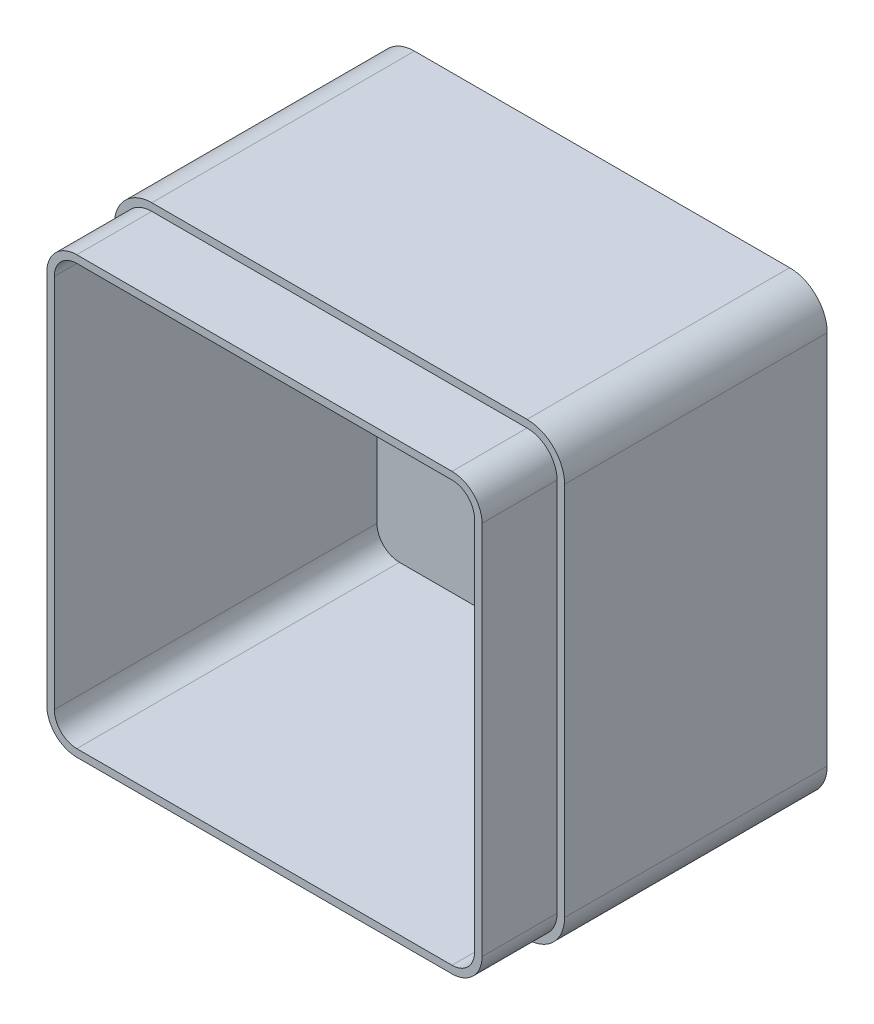
ISO-10303-21;
HEADER;
FILE_DESCRIPTION(('STEP AP214'),'2;1');
FILE_NAME('part.step','',(''),(''),'','','');
FILE_SCHEMA(('AUTOMOTIVE_DESIGN { 1 0 10303 214 1 1 1 1 }'));
ENDSEC;
DATA;
#1=APPLICATION_CONTEXT('core data for automotive mechanical design processes');
#2=APPLICATION_PROTOCOL_DEFINITION('international standard','automotive_design',2000,#1);
#3=PRODUCT_CONTEXT('',#1,'mechanical');
#4=PRODUCT('Part','Part','',(#3));
#5=PRODUCT_RELATED_PRODUCT_CATEGORY('part','',(#4));
#6=PRODUCT_DEFINITION_FORMATION('','',#4);
#7=PRODUCT_DEFINITION_CONTEXT('part definition',#1,'design');
#8=PRODUCT_DEFINITION('design','',#6,#7);
#9=PRODUCT_DEFINITION_SHAPE('','',#8);
#10=(LENGTH_UNIT() NAMED_UNIT(*) SI_UNIT(.MILLI.,.METRE.));
#11=(NAMED_UNIT(*) PLANE_ANGLE_UNIT() SI_UNIT($,.RADIAN.));
#12=(NAMED_UNIT(*) SI_UNIT($,.STERADIAN.) SOLID_ANGLE_UNIT());
#13=UNCERTAINTY_MEASURE_WITH_UNIT(LENGTH_MEASURE(1.E-05),#10,'distance_accuracy_value','');
#14=(GEOMETRIC_REPRESENTATION_CONTEXT(3) GLOBAL_UNCERTAINTY_ASSIGNED_CONTEXT((#13)) GLOBAL_UNIT_ASSIGNED_CONTEXT((#10,
#11,#12)) REPRESENTATION_CONTEXT('',''));
#15=CARTESIAN_POINT('',(0.,0.,0.));
#16=DIRECTION('',(0.,0.,1.));
#17=DIRECTION('',(1.,0.,0.));
#18=AXIS2_PLACEMENT_3D('',#15,#16,#17);
#19=CARTESIAN_POINT('',(0.,0.,90.));
#20=DIRECTION('',(0.,0.,-1.));
#21=DIRECTION('',(-1.,0.,0.));
#22=AXIS2_PLACEMENT_3D('',#19,#20,#21);
#23=PLANE('',#22);
#24=DIRECTION('',(0.,-1.,0.));
#25=VECTOR('',#24,1.);
#26=CARTESIAN_POINT('',(4.,0.,90.));
#27=LINE('',#26,#25);
#28=CARTESIAN_POINT('',(3.99999999999996,110.,90.));
#29=VERTEX_POINT('',#28);
#30=CARTESIAN_POINT('',(4.,10.,90.));
#31=VERTEX_POINT('',#30);
#32=EDGE_CURVE('E349',#29,#31,#27,.T.);
#33=ORIENTED_EDGE('',*,*,#32,.F.);
#34=CARTESIAN_POINT('',(9.99999999999996,110.,90.));
#35=DIRECTION('',(0.,0.,-1.));
#36=DIRECTION('',(-1.,0.,0.));
#37=AXIS2_PLACEMENT_3D('',#34,#35,#36);
#38=CIRCLE('',#37,6.);
#39=CARTESIAN_POINT('',(9.99999999999996,116.,90.));
#40=VERTEX_POINT('',#39);
#41=EDGE_CURVE('E327',#40,#29,#38,.F.);
#42=ORIENTED_EDGE('',*,*,#41,.F.);
#43=DIRECTION('',(-1.,0.,0.));
#44=VECTOR('',#43,1.);
#45=CARTESIAN_POINT('',(0.,116.,90.));
#46=LINE('',#45,#44);
#47=CARTESIAN_POINT('',(110.,116.,90.));
#48=VERTEX_POINT('',#47);
#49=EDGE_CURVE('E363',#48,#40,#46,.T.);
#50=ORIENTED_EDGE('',*,*,#49,.F.);
#51=CARTESIAN_POINT('',(110.,110.,90.));
#52=DIRECTION('',(0.,0.,-1.));
#53=DIRECTION('',(-1.,0.,0.));
#54=AXIS2_PLACEMENT_3D('',#51,#52,#53);
#55=CIRCLE('',#54,6.);
#56=CARTESIAN_POINT('',(116.,110.,90.));
#57=VERTEX_POINT('',#56);
#58=EDGE_CURVE('E394',#57,#48,#55,.F.);
#59=ORIENTED_EDGE('',*,*,#58,.F.);
#60=DIRECTION('',(0.,1.,0.));
#61=VECTOR('',#60,1.);
#62=CARTESIAN_POINT('',(116.,0.,90.));
#63=LINE('',#62,#61);
#64=CARTESIAN_POINT('',(116.,10.,90.));
#65=VERTEX_POINT('',#64);
#66=EDGE_CURVE('E391',#65,#57,#63,.T.);
#67=ORIENTED_EDGE('',*,*,#66,.F.);
#68=CARTESIAN_POINT('',(110.,10.,90.));
#69=DIRECTION('',(0.,0.,-1.));
#70=DIRECTION('',(-1.,0.,0.));
#71=AXIS2_PLACEMENT_3D('',#68,#69,#70);
#72=CIRCLE('',#71,6.);
#73=CARTESIAN_POINT('',(110.,4.,90.));
#74=VERTEX_POINT('',#73);
#75=EDGE_CURVE('E387',#74,#65,#72,.F.);
#76=ORIENTED_EDGE('',*,*,#75,.F.);
#77=DIRECTION('',(1.,0.,0.));
#78=VECTOR('',#77,1.);
#79=CARTESIAN_POINT('',(0.,4.,90.));
#80=LINE('',#79,#78);
#81=CARTESIAN_POINT('',(9.99999999999999,4.,90.));
#82=VERTEX_POINT('',#81);
#83=EDGE_CURVE('E384',#82,#74,#80,.T.);
#84=ORIENTED_EDGE('',*,*,#83,.F.);
#85=CARTESIAN_POINT('',(9.99999999999999,10.,90.));
#86=DIRECTION('',(0.,0.,-1.));
#87=DIRECTION('',(-1.,0.,0.));
#88=AXIS2_PLACEMENT_3D('',#85,#86,#87);
#89=CIRCLE('',#88,6.);
#90=EDGE_CURVE('E372',#31,#82,#89,.F.);
#91=ORIENTED_EDGE('',*,*,#90,.F.);
#92=EDGE_LOOP('',(#33,#42,#50,#59,#67,#76,#84,#91));
#93=FACE_BOUND('',#92,.T.);
#94=CARTESIAN_POINT('',(9.99999999999996,110.,90.));
#95=DIRECTION('',(0.,0.,1.));
#96=DIRECTION('',(1.,0.,0.));
#97=AXIS2_PLACEMENT_3D('',#94,#95,#96);
#98=CIRCLE('',#97,8.);
#99=CARTESIAN_POINT('',(9.99999999999995,118.,90.));
#100=VERTEX_POINT('',#99);
#101=CARTESIAN_POINT('',(1.99999999999996,110.,90.));
#102=VERTEX_POINT('',#101);
#103=EDGE_CURVE('E255',#100,#102,#98,.T.);
#104=ORIENTED_EDGE('',*,*,#103,.T.);
#105=DIRECTION('',(0.,-1.,0.));
#106=VECTOR('',#105,1.);
#107=CARTESIAN_POINT('',(1.99999999999996,110.,90.));
#108=LINE('',#107,#106);
#109=CARTESIAN_POINT('',(2.,9.99999999999999,90.));
#110=VERTEX_POINT('',#109);
#111=EDGE_CURVE('E205',#102,#110,#108,.T.);
#112=ORIENTED_EDGE('',*,*,#111,.T.);
#113=CARTESIAN_POINT('',(9.99999999999999,10.,90.));
#114=DIRECTION('',(0.,0.,1.));
#115=DIRECTION('',(1.,0.,0.));
#116=AXIS2_PLACEMENT_3D('',#113,#114,#115);
#117=CIRCLE('',#116,8.);
#118=CARTESIAN_POINT('',(9.99999999999999,2.,90.));
#119=VERTEX_POINT('',#118);
#120=EDGE_CURVE('E54',#110,#119,#117,.T.);
#121=ORIENTED_EDGE('',*,*,#120,.T.);
#122=DIRECTION('',(1.,0.,0.));
#123=VECTOR('',#122,1.);
#124=CARTESIAN_POINT('',(9.99999999999999,2.,90.));
#125=LINE('',#124,#123);
#126=CARTESIAN_POINT('',(110.,2.,90.));
#127=VERTEX_POINT('',#126);
#128=EDGE_CURVE('E262',#119,#127,#125,.T.);
#129=ORIENTED_EDGE('',*,*,#128,.T.);
#130=CARTESIAN_POINT('',(110.,10.,90.));
#131=DIRECTION('',(0.,0.,1.));
#132=DIRECTION('',(1.,0.,0.));
#133=AXIS2_PLACEMENT_3D('',#130,#131,#132);
#134=CIRCLE('',#133,7.99999999999999);
#135=CARTESIAN_POINT('',(118.,10.,90.));
#136=VERTEX_POINT('',#135);
#137=EDGE_CURVE('E266',#127,#136,#134,.T.);
#138=ORIENTED_EDGE('',*,*,#137,.T.);
#139=DIRECTION('',(0.,1.,0.));
#140=VECTOR('',#139,1.);
#141=CARTESIAN_POINT('',(118.,10.,90.));
#142=LINE('',#141,#140);
#143=CARTESIAN_POINT('',(118.,110.,90.));
#144=VERTEX_POINT('',#143);
#145=EDGE_CURVE('E270',#136,#144,#142,.T.);
#146=ORIENTED_EDGE('',*,*,#145,.T.);
#147=CARTESIAN_POINT('',(110.,110.,90.));
#148=DIRECTION('',(0.,0.,1.));
#149=DIRECTION('',(1.,0.,0.));
#150=AXIS2_PLACEMENT_3D('',#147,#148,#149);
#151=CIRCLE('',#150,7.99999999999999);
#152=CARTESIAN_POINT('',(110.,118.,90.));
#153=VERTEX_POINT('',#152);
#154=EDGE_CURVE('E232',#144,#153,#151,.T.);
#155=ORIENTED_EDGE('',*,*,#154,.T.);
#156=DIRECTION('',(-1.,0.,0.));
#157=VECTOR('',#156,1.);
#158=CARTESIAN_POINT('',(110.,118.,90.));
#159=LINE('',#158,#157);
#160=EDGE_CURVE('E228',#153,#100,#159,.T.);
#161=ORIENTED_EDGE('',*,*,#160,.T.);
#162=EDGE_LOOP('',(#104,#112,#121,#129,#138,#146,#155,#161));
#163=FACE_BOUND('',#162,.T.);
#164=ADVANCED_FACE('F38',(#93,#163),#23,.F.);
#165=CARTESIAN_POINT('',(4.,0.,90.));
#166=DIRECTION('',(1.,0.,0.));
#167=DIRECTION('',(0.,1.,0.));
#168=AXIS2_PLACEMENT_3D('',#165,#166,#167);
#169=PLANE('',#168);
#170=DIRECTION('',(0.,-1.,0.));
#171=VECTOR('',#170,1.);
#172=CARTESIAN_POINT('',(4.,0.,4.));
#173=LINE('',#172,#171);
#174=CARTESIAN_POINT('',(3.99999999999996,110.,4.));
#175=VERTEX_POINT('',#174);
#176=CARTESIAN_POINT('',(4.,10.,4.));
#177=VERTEX_POINT('',#176);
#178=EDGE_CURVE('E319',#175,#177,#173,.T.);
#179=ORIENTED_EDGE('',*,*,#178,.F.);
#180=DIRECTION('',(0.,0.,1.));
#181=VECTOR('',#180,1.);
#182=CARTESIAN_POINT('',(3.99999999999996,110.,90.));
#183=LINE('',#182,#181);
#184=EDGE_CURVE('E328',#29,#175,#183,.F.);
#185=ORIENTED_EDGE('',*,*,#184,.F.);
#186=ORIENTED_EDGE('',*,*,#32,.T.);
#187=DIRECTION('',(0.,0.,1.));
#188=VECTOR('',#187,1.);
#189=CARTESIAN_POINT('',(4.,10.,90.));
#190=LINE('',#189,#188);
#191=EDGE_CURVE('E324',#177,#31,#190,.T.);
#192=ORIENTED_EDGE('',*,*,#191,.F.);
#193=EDGE_LOOP('',(#179,#185,#186,#192));
#194=FACE_BOUND('',#193,.T.);
#195=ADVANCED_FACE('F504',(#194),#169,.T.);
#196=CARTESIAN_POINT('',(0.,4.,90.));
#197=DIRECTION('',(0.,1.,0.));
#198=DIRECTION('',(0.,0.,1.));
#199=AXIS2_PLACEMENT_3D('',#196,#197,#198);
#200=PLANE('',#199);
#201=ORIENTED_EDGE('',*,*,#83,.T.);
#202=DIRECTION('',(0.,0.,1.));
#203=VECTOR('',#202,1.);
#204=CARTESIAN_POINT('',(110.,4.,90.));
#205=LINE('',#204,#203);
#206=CARTESIAN_POINT('',(110.,4.,4.));
#207=VERTEX_POINT('',#206);
#208=EDGE_CURVE('E360',#207,#74,#205,.T.);
#209=ORIENTED_EDGE('',*,*,#208,.F.);
#210=DIRECTION('',(1.,0.,0.));
#211=VECTOR('',#210,1.);
#212=CARTESIAN_POINT('',(0.,4.,4.));
#213=LINE('',#212,#211);
#214=CARTESIAN_POINT('',(9.99999999999999,4.,4.));
#215=VERTEX_POINT('',#214);
#216=EDGE_CURVE('E323',#215,#207,#213,.T.);
#217=ORIENTED_EDGE('',*,*,#216,.F.);
#218=DIRECTION('',(0.,0.,1.));
#219=VECTOR('',#218,1.);
#220=CARTESIAN_POINT('',(9.99999999999999,4.,90.));
#221=LINE('',#220,#219);
#222=EDGE_CURVE('E344',#82,#215,#221,.F.);
#223=ORIENTED_EDGE('',*,*,#222,.F.);
#224=EDGE_LOOP('',(#201,#209,#217,#223));
#225=FACE_BOUND('',#224,.T.);
#226=ADVANCED_FACE('F510',(#225),#200,.T.);
#227=CARTESIAN_POINT('',(116.,0.,90.));
#228=DIRECTION('',(-1.,0.,0.));
#229=DIRECTION('',(0.,-1.,0.));
#230=AXIS2_PLACEMENT_3D('',#227,#228,#229);
#231=PLANE('',#230);
#232=ORIENTED_EDGE('',*,*,#66,.T.);
#233=DIRECTION('',(0.,0.,1.));
#234=VECTOR('',#233,1.);
#235=CARTESIAN_POINT('',(116.,110.,90.));
#236=LINE('',#235,#234);
#237=CARTESIAN_POINT('',(116.,110.,4.));
#238=VERTEX_POINT('',#237);
#239=EDGE_CURVE('E369',#238,#57,#236,.T.);
#240=ORIENTED_EDGE('',*,*,#239,.F.);
#241=DIRECTION('',(0.,1.,0.));
#242=VECTOR('',#241,1.);
#243=CARTESIAN_POINT('',(116.,0.,4.));
#244=LINE('',#243,#242);
#245=CARTESIAN_POINT('',(116.,10.,4.));
#246=VERTEX_POINT('',#245);
#247=EDGE_CURVE('E336',#246,#238,#244,.T.);
#248=ORIENTED_EDGE('',*,*,#247,.F.);
#249=DIRECTION('',(0.,0.,1.));
#250=VECTOR('',#249,1.);
#251=CARTESIAN_POINT('',(116.,10.,90.));
#252=LINE('',#251,#250);
#253=EDGE_CURVE('E364',#65,#246,#252,.F.);
#254=ORIENTED_EDGE('',*,*,#253,.F.);
#255=EDGE_LOOP('',(#232,#240,#248,#254));
#256=FACE_BOUND('',#255,.T.);
#257=ADVANCED_FACE('F539',(#256),#231,.T.);
#258=CARTESIAN_POINT('',(0.,116.,90.));
#259=DIRECTION('',(0.,-1.,0.));
#260=DIRECTION('',(0.,0.,-1.));
#261=AXIS2_PLACEMENT_3D('',#258,#259,#260);
#262=PLANE('',#261);
#263=ORIENTED_EDGE('',*,*,#49,.T.);
#264=DIRECTION('',(0.,0.,-1.));
#265=VECTOR('',#264,1.);
#266=CARTESIAN_POINT('',(9.99999999999996,116.,90.));
#267=LINE('',#266,#265);
#268=CARTESIAN_POINT('',(9.99999999999996,116.,4.));
#269=VERTEX_POINT('',#268);
#270=EDGE_CURVE('E368',#269,#40,#267,.F.);
#271=ORIENTED_EDGE('',*,*,#270,.F.);
#272=DIRECTION('',(-1.,0.,0.));
#273=VECTOR('',#272,1.);
#274=CARTESIAN_POINT('',(0.,116.,4.));
#275=LINE('',#274,#273);
#276=CARTESIAN_POINT('',(110.,116.,4.));
#277=VERTEX_POINT('',#276);
#278=EDGE_CURVE('E345',#277,#269,#275,.T.);
#279=ORIENTED_EDGE('',*,*,#278,.F.);
#280=DIRECTION('',(0.,0.,-1.));
#281=VECTOR('',#280,1.);
#282=CARTESIAN_POINT('',(110.,116.,90.));
#283=LINE('',#282,#281);
#284=EDGE_CURVE('E373',#48,#277,#283,.T.);
#285=ORIENTED_EDGE('',*,*,#284,.F.);
#286=EDGE_LOOP('',(#263,#271,#279,#285));
#287=FACE_BOUND('',#286,.T.);
#288=ADVANCED_FACE('F535',(#287),#262,.T.);
#289=CARTESIAN_POINT('',(0.,0.,4.));
#290=DIRECTION('',(0.,0.,-1.));
#291=DIRECTION('',(-1.,0.,0.));
#292=AXIS2_PLACEMENT_3D('',#289,#290,#291);
#293=PLANE('',#292);
#294=ORIENTED_EDGE('',*,*,#216,.T.);
#295=CARTESIAN_POINT('',(110.,10.,4.));
#296=DIRECTION('',(0.,0.,-1.));
#297=DIRECTION('',(-1.,0.,0.));
#298=AXIS2_PLACEMENT_3D('',#295,#296,#297);
#299=CIRCLE('',#298,6.);
#300=EDGE_CURVE('E339',#246,#207,#299,.T.);
#301=ORIENTED_EDGE('',*,*,#300,.F.);
#302=ORIENTED_EDGE('',*,*,#247,.T.);
#303=CARTESIAN_POINT('',(110.,110.,4.));
#304=DIRECTION('',(0.,0.,-1.));
#305=DIRECTION('',(-1.,0.,0.));
#306=AXIS2_PLACEMENT_3D('',#303,#304,#305);
#307=CIRCLE('',#306,6.);
#308=EDGE_CURVE('E343',#277,#238,#307,.T.);
#309=ORIENTED_EDGE('',*,*,#308,.F.);
#310=ORIENTED_EDGE('',*,*,#278,.T.);
#311=CARTESIAN_POINT('',(9.99999999999996,110.,4.));
#312=DIRECTION('',(0.,0.,-1.));
#313=DIRECTION('',(-1.,0.,0.));
#314=AXIS2_PLACEMENT_3D('',#311,#312,#313);
#315=CIRCLE('',#314,6.);
#316=EDGE_CURVE('E340',#175,#269,#315,.T.);
#317=ORIENTED_EDGE('',*,*,#316,.F.);
#318=ORIENTED_EDGE('',*,*,#178,.T.);
#319=CARTESIAN_POINT('',(9.99999999999999,10.,4.));
#320=DIRECTION('',(0.,0.,-1.));
#321=DIRECTION('',(-1.,0.,0.));
#322=AXIS2_PLACEMENT_3D('',#319,#320,#321);
#323=CIRCLE('',#322,6.);
#324=EDGE_CURVE('E332',#215,#177,#323,.T.);
#325=ORIENTED_EDGE('',*,*,#324,.F.);
#326=EDGE_LOOP('',(#294,#301,#302,#309,#310,#317,#318,#325));
#327=FACE_BOUND('',#326,.T.);
#328=ADVANCED_FACE('F531',(#327),#293,.F.);
#329=CARTESIAN_POINT('',(9.99999999999999,10.,90.));
#330=DIRECTION('',(0.,0.,-1.));
#331=DIRECTION('',(-1.,0.,0.));
#332=AXIS2_PLACEMENT_3D('',#329,#330,#331);
#333=CYLINDRICAL_SURFACE('',#332,6.);
#334=ORIENTED_EDGE('',*,*,#90,.T.);
#335=ORIENTED_EDGE('',*,*,#222,.T.);
#336=ORIENTED_EDGE('',*,*,#324,.T.);
#337=ORIENTED_EDGE('',*,*,#191,.T.);
#338=EDGE_LOOP('',(#334,#335,#336,#337));
#339=FACE_BOUND('',#338,.T.);
#340=ADVANCED_FACE('F527',(#339),#333,.F.);
#341=CARTESIAN_POINT('',(110.,10.,90.));
#342=DIRECTION('',(0.,0.,-1.));
#343=DIRECTION('',(-1.,0.,0.));
#344=AXIS2_PLACEMENT_3D('',#341,#342,#343);
#345=CYLINDRICAL_SURFACE('',#344,6.);
#346=ORIENTED_EDGE('',*,*,#75,.T.);
#347=ORIENTED_EDGE('',*,*,#253,.T.);
#348=ORIENTED_EDGE('',*,*,#300,.T.);
#349=ORIENTED_EDGE('',*,*,#208,.T.);
#350=EDGE_LOOP('',(#346,#347,#348,#349));
#351=FACE_BOUND('',#350,.T.);
#352=ADVANCED_FACE('F523',(#351),#345,.F.);
#353=CARTESIAN_POINT('',(110.,110.,90.));
#354=DIRECTION('',(0.,0.,-1.));
#355=DIRECTION('',(-1.,0.,0.));
#356=AXIS2_PLACEMENT_3D('',#353,#354,#355);
#357=CYLINDRICAL_SURFACE('',#356,6.);
#358=ORIENTED_EDGE('',*,*,#58,.T.);
#359=ORIENTED_EDGE('',*,*,#284,.T.);
#360=ORIENTED_EDGE('',*,*,#308,.T.);
#361=ORIENTED_EDGE('',*,*,#239,.T.);
#362=EDGE_LOOP('',(#358,#359,#360,#361));
#363=FACE_BOUND('',#362,.T.);
#364=ADVANCED_FACE('F519',(#363),#357,.F.);
#365=CARTESIAN_POINT('',(9.99999999999996,110.,90.));
#366=DIRECTION('',(0.,0.,-1.));
#367=DIRECTION('',(-1.,0.,0.));
#368=AXIS2_PLACEMENT_3D('',#365,#366,#367);
#369=CYLINDRICAL_SURFACE('',#368,6.);
#370=ORIENTED_EDGE('',*,*,#41,.T.);
#371=ORIENTED_EDGE('',*,*,#184,.T.);
#372=ORIENTED_EDGE('',*,*,#316,.T.);
#373=ORIENTED_EDGE('',*,*,#270,.T.);
#374=EDGE_LOOP('',(#370,#371,#372,#373));
#375=FACE_BOUND('',#374,.T.);
#376=ADVANCED_FACE('F516',(#375),#369,.F.);
#377=CARTESIAN_POINT('',(9.99999999999996,110.,70.));
#378=DIRECTION('',(0.,0.,1.));
#379=DIRECTION('',(1.,0.,0.));
#380=AXIS2_PLACEMENT_3D('',#377,#378,#379);
#381=PLANE('',#380);
#382=DIRECTION('',(-1.,0.,0.));
#383=VECTOR('',#382,1.);
#384=CARTESIAN_POINT('',(110.,118.,70.));
#385=LINE('',#384,#383);
#386=CARTESIAN_POINT('',(110.,118.,70.));
#387=VERTEX_POINT('',#386);
#388=CARTESIAN_POINT('',(9.99999999999995,118.,70.));
#389=VERTEX_POINT('',#388);
#390=EDGE_CURVE('E212',#387,#389,#385,.T.);
#391=ORIENTED_EDGE('',*,*,#390,.F.);
#392=CARTESIAN_POINT('',(110.,110.,70.));
#393=DIRECTION('',(0.,0.,1.));
#394=DIRECTION('',(1.,0.,0.));
#395=AXIS2_PLACEMENT_3D('',#392,#393,#394);
#396=CIRCLE('',#395,7.99999999999999);
#397=CARTESIAN_POINT('',(118.,110.,70.));
#398=VERTEX_POINT('',#397);
#399=EDGE_CURVE('E249',#398,#387,#396,.T.);
#400=ORIENTED_EDGE('',*,*,#399,.F.);
#401=DIRECTION('',(0.,1.,0.));
#402=VECTOR('',#401,1.);
#403=CARTESIAN_POINT('',(118.,10.,70.));
#404=LINE('',#403,#402);
#405=CARTESIAN_POINT('',(118.,10.,70.));
#406=VERTEX_POINT('',#405);
#407=EDGE_CURVE('E245',#406,#398,#404,.T.);
#408=ORIENTED_EDGE('',*,*,#407,.F.);
#409=CARTESIAN_POINT('',(110.,10.,70.));
#410=DIRECTION('',(0.,0.,1.));
#411=DIRECTION('',(1.,0.,0.));
#412=AXIS2_PLACEMENT_3D('',#409,#410,#411);
#413=CIRCLE('',#412,7.99999999999999);
#414=CARTESIAN_POINT('',(110.,2.,70.));
#415=VERTEX_POINT('',#414);
#416=EDGE_CURVE('E241',#415,#406,#413,.T.);
#417=ORIENTED_EDGE('',*,*,#416,.F.);
#418=DIRECTION('',(1.,0.,0.));
#419=VECTOR('',#418,1.);
#420=CARTESIAN_POINT('',(9.99999999999999,2.,70.));
#421=LINE('',#420,#419);
#422=CARTESIAN_POINT('',(9.99999999999999,2.,70.));
#423=VERTEX_POINT('',#422);
#424=EDGE_CURVE('E237',#423,#415,#421,.T.);
#425=ORIENTED_EDGE('',*,*,#424,.F.);
#426=CARTESIAN_POINT('',(9.99999999999999,10.,70.));
#427=DIRECTION('',(0.,0.,1.));
#428=DIRECTION('',(1.,0.,0.));
#429=AXIS2_PLACEMENT_3D('',#426,#427,#428);
#430=CIRCLE('',#429,8.);
#431=CARTESIAN_POINT('',(2.,9.99999999999999,70.));
#432=VERTEX_POINT('',#431);
#433=EDGE_CURVE('E222',#432,#423,#430,.T.);
#434=ORIENTED_EDGE('',*,*,#433,.F.);
#435=DIRECTION('',(0.,-1.,0.));
#436=VECTOR('',#435,1.);
#437=CARTESIAN_POINT('',(1.99999999999996,110.,70.));
#438=LINE('',#437,#436);
#439=CARTESIAN_POINT('',(1.99999999999996,110.,70.));
#440=VERTEX_POINT('',#439);
#441=EDGE_CURVE('E203',#440,#432,#438,.T.);
#442=ORIENTED_EDGE('',*,*,#441,.F.);
#443=CARTESIAN_POINT('',(9.99999999999996,110.,70.));
#444=DIRECTION('',(0.,0.,1.));
#445=DIRECTION('',(1.,0.,0.));
#446=AXIS2_PLACEMENT_3D('',#443,#444,#445);
#447=CIRCLE('',#446,8.);
#448=EDGE_CURVE('E218',#389,#440,#447,.T.);
#449=ORIENTED_EDGE('',*,*,#448,.F.);
#450=EDGE_LOOP('',(#391,#400,#408,#417,#425,#434,#442,#449));
#451=FACE_BOUND('',#450,.T.);
#452=CARTESIAN_POINT('',(9.99999999999996,110.,70.));
#453=DIRECTION('',(0.,0.,1.));
#454=DIRECTION('',(1.,0.,0.));
#455=AXIS2_PLACEMENT_3D('',#452,#453,#454);
#456=CIRCLE('',#455,10.);
#457=CARTESIAN_POINT('',(9.99999999999996,120.,70.));
#458=VERTEX_POINT('',#457);
#459=CARTESIAN_POINT('',(0.,110.,70.));
#460=VERTEX_POINT('',#459);
#461=EDGE_CURVE('E279',#458,#460,#456,.T.);
#462=ORIENTED_EDGE('',*,*,#461,.T.);
#463=DIRECTION('',(0.,-1.,0.));
#464=VECTOR('',#463,1.);
#465=CARTESIAN_POINT('',(0.,110.,70.));
#466=LINE('',#465,#464);
#467=CARTESIAN_POINT('',(0.,9.99999999999999,70.));
#468=VERTEX_POINT('',#467);
#469=EDGE_CURVE('E299',#460,#468,#466,.T.);
#470=ORIENTED_EDGE('',*,*,#469,.T.);
#471=CARTESIAN_POINT('',(9.99999999999999,10.,70.));
#472=DIRECTION('',(0.,0.,1.));
#473=DIRECTION('',(1.,0.,0.));
#474=AXIS2_PLACEMENT_3D('',#471,#472,#473);
#475=CIRCLE('',#474,10.);
#476=CARTESIAN_POINT('',(9.99999999999999,0.,70.));
#477=VERTEX_POINT('',#476);
#478=EDGE_CURVE('E302',#468,#477,#475,.T.);
#479=ORIENTED_EDGE('',*,*,#478,.T.);
#480=DIRECTION('',(1.,0.,0.));
#481=VECTOR('',#480,1.);
#482=CARTESIAN_POINT('',(9.99999999999999,0.,70.));
#483=LINE('',#482,#481);
#484=CARTESIAN_POINT('',(110.,0.,70.));
#485=VERTEX_POINT('',#484);
#486=EDGE_CURVE('E305',#477,#485,#483,.T.);
#487=ORIENTED_EDGE('',*,*,#486,.T.);
#488=CARTESIAN_POINT('',(110.,10.,70.));
#489=DIRECTION('',(0.,0.,1.));
#490=DIRECTION('',(1.,0.,0.));
#491=AXIS2_PLACEMENT_3D('',#488,#489,#490);
#492=CIRCLE('',#491,9.99999999999999);
#493=CARTESIAN_POINT('',(120.,10.,70.));
#494=VERTEX_POINT('',#493);
#495=EDGE_CURVE('E308',#485,#494,#492,.T.);
#496=ORIENTED_EDGE('',*,*,#495,.T.);
#497=DIRECTION('',(0.,1.,0.));
#498=VECTOR('',#497,1.);
#499=CARTESIAN_POINT('',(120.,10.,70.));
#500=LINE('',#499,#498);
#501=CARTESIAN_POINT('',(120.,110.,70.));
#502=VERTEX_POINT('',#501);
#503=EDGE_CURVE('E311',#494,#502,#500,.T.);
#504=ORIENTED_EDGE('',*,*,#503,.T.);
#505=CARTESIAN_POINT('',(110.,110.,70.));
#506=DIRECTION('',(0.,0.,1.));
#507=DIRECTION('',(1.,0.,0.));
#508=AXIS2_PLACEMENT_3D('',#505,#506,#507);
#509=CIRCLE('',#508,9.99999999999999);
#510=CARTESIAN_POINT('',(110.,120.,70.));
#511=VERTEX_POINT('',#510);
#512=EDGE_CURVE('E314',#502,#511,#509,.T.);
#513=ORIENTED_EDGE('',*,*,#512,.T.);
#514=DIRECTION('',(-1.,0.,0.));
#515=VECTOR('',#514,1.);
#516=CARTESIAN_POINT('',(110.,120.,70.));
#517=LINE('',#516,#515);
#518=EDGE_CURVE('E62',#511,#458,#517,.T.);
#519=ORIENTED_EDGE('',*,*,#518,.T.);
#520=EDGE_LOOP('',(#462,#470,#479,#487,#496,#504,#513,#519));
#521=FACE_BOUND('',#520,.T.);
#522=ADVANCED_FACE('F217',(#451,#521),#381,.T.);
#523=CARTESIAN_POINT('',(9.99999999999996,110.,70.));
#524=DIRECTION('',(0.,0.,1.));
#525=DIRECTION('',(1.,0.,0.));
#526=AXIS2_PLACEMENT_3D('',#523,#524,#525);
#527=CYLINDRICAL_SURFACE('',#526,8.);
#528=ORIENTED_EDGE('',*,*,#103,.F.);
#529=DIRECTION('',(0.,0.,1.));
#530=VECTOR('',#529,1.);
#531=CARTESIAN_POINT('',(9.99999999999995,118.,70.));
#532=LINE('',#531,#530);
#533=EDGE_CURVE('E226',#389,#100,#532,.T.);
#534=ORIENTED_EDGE('',*,*,#533,.F.);
#535=ORIENTED_EDGE('',*,*,#448,.T.);
#536=DIRECTION('',(0.,0.,1.));
#537=VECTOR('',#536,1.);
#538=CARTESIAN_POINT('',(1.99999999999996,110.,70.));
#539=LINE('',#538,#537);
#540=EDGE_CURVE('E200',#440,#102,#539,.T.);
#541=ORIENTED_EDGE('',*,*,#540,.T.);
#542=EDGE_LOOP('',(#528,#534,#535,#541));
#543=FACE_BOUND('',#542,.T.);
#544=ADVANCED_FACE('F225',(#543),#527,.T.);
#545=CARTESIAN_POINT('',(110.,118.,70.));
#546=DIRECTION('',(0.,1.,0.));
#547=DIRECTION('',(0.,0.,1.));
#548=AXIS2_PLACEMENT_3D('',#545,#546,#547);
#549=PLANE('',#548);
#550=ORIENTED_EDGE('',*,*,#160,.F.);
#551=DIRECTION('',(0.,0.,1.));
#552=VECTOR('',#551,1.);
#553=CARTESIAN_POINT('',(110.,118.,70.));
#554=LINE('',#553,#552);
#555=EDGE_CURVE('E280',#387,#153,#554,.T.);
#556=ORIENTED_EDGE('',*,*,#555,.F.);
#557=ORIENTED_EDGE('',*,*,#390,.T.);
#558=ORIENTED_EDGE('',*,*,#533,.T.);
#559=EDGE_LOOP('',(#550,#556,#557,#558));
#560=FACE_BOUND('',#559,.T.);
#561=ADVANCED_FACE('F550',(#560),#549,.T.);
#562=CARTESIAN_POINT('',(110.,110.,70.));
#563=DIRECTION('',(0.,0.,1.));
#564=DIRECTION('',(1.,0.,0.));
#565=AXIS2_PLACEMENT_3D('',#562,#563,#564);
#566=CYLINDRICAL_SURFACE('',#565,7.99999999999999);
#567=ORIENTED_EDGE('',*,*,#154,.F.);
#568=DIRECTION('',(0.,0.,1.));
#569=VECTOR('',#568,1.);
#570=CARTESIAN_POINT('',(118.,110.,70.));
#571=LINE('',#570,#569);
#572=EDGE_CURVE('E283',#398,#144,#571,.T.);
#573=ORIENTED_EDGE('',*,*,#572,.F.);
#574=ORIENTED_EDGE('',*,*,#399,.T.);
#575=ORIENTED_EDGE('',*,*,#555,.T.);
#576=EDGE_LOOP('',(#567,#573,#574,#575));
#577=FACE_BOUND('',#576,.T.);
#578=ADVANCED_FACE('F565',(#577),#566,.T.);
#579=CARTESIAN_POINT('',(118.,10.,70.));
#580=DIRECTION('',(1.,0.,0.));
#581=DIRECTION('',(0.,1.,0.));
#582=AXIS2_PLACEMENT_3D('',#579,#580,#581);
#583=PLANE('',#582);
#584=ORIENTED_EDGE('',*,*,#145,.F.);
#585=DIRECTION('',(0.,0.,1.));
#586=VECTOR('',#585,1.);
#587=CARTESIAN_POINT('',(118.,10.,70.));
#588=LINE('',#587,#586);
#589=EDGE_CURVE('E286',#406,#136,#588,.T.);
#590=ORIENTED_EDGE('',*,*,#589,.F.);
#591=ORIENTED_EDGE('',*,*,#407,.T.);
#592=ORIENTED_EDGE('',*,*,#572,.T.);
#593=EDGE_LOOP('',(#584,#590,#591,#592));
#594=FACE_BOUND('',#593,.T.);
#595=ADVANCED_FACE('F561',(#594),#583,.T.);
#596=CARTESIAN_POINT('',(110.,10.,70.));
#597=DIRECTION('',(0.,0.,1.));
#598=DIRECTION('',(1.,0.,0.));
#599=AXIS2_PLACEMENT_3D('',#596,#597,#598);
#600=CYLINDRICAL_SURFACE('',#599,7.99999999999999);
#601=ORIENTED_EDGE('',*,*,#137,.F.);
#602=DIRECTION('',(0.,0.,1.));
#603=VECTOR('',#602,1.);
#604=CARTESIAN_POINT('',(110.,2.,70.));
#605=LINE('',#604,#603);
#606=EDGE_CURVE('E289',#415,#127,#605,.T.);
#607=ORIENTED_EDGE('',*,*,#606,.F.);
#608=ORIENTED_EDGE('',*,*,#416,.T.);
#609=ORIENTED_EDGE('',*,*,#589,.T.);
#610=EDGE_LOOP('',(#601,#607,#608,#609));
#611=FACE_BOUND('',#610,.T.);
#612=ADVANCED_FACE('F557',(#611),#600,.T.);
#613=CARTESIAN_POINT('',(9.99999999999999,2.,70.));
#614=DIRECTION('',(0.,-1.,0.));
#615=DIRECTION('',(0.,0.,-1.));
#616=AXIS2_PLACEMENT_3D('',#613,#614,#615);
#617=PLANE('',#616);
#618=ORIENTED_EDGE('',*,*,#128,.F.);
#619=DIRECTION('',(0.,0.,1.));
#620=VECTOR('',#619,1.);
#621=CARTESIAN_POINT('',(9.99999999999999,2.,70.));
#622=LINE('',#621,#620);
#623=EDGE_CURVE('E292',#423,#119,#622,.T.);
#624=ORIENTED_EDGE('',*,*,#623,.F.);
#625=ORIENTED_EDGE('',*,*,#424,.T.);
#626=ORIENTED_EDGE('',*,*,#606,.T.);
#627=EDGE_LOOP('',(#618,#624,#625,#626));
#628=FACE_BOUND('',#627,.T.);
#629=ADVANCED_FACE('F554',(#628),#617,.T.);
#630=CARTESIAN_POINT('',(9.99999999999999,10.,70.));
#631=DIRECTION('',(0.,0.,1.));
#632=DIRECTION('',(1.,0.,0.));
#633=AXIS2_PLACEMENT_3D('',#630,#631,#632);
#634=CYLINDRICAL_SURFACE('',#633,8.);
#635=ORIENTED_EDGE('',*,*,#120,.F.);
#636=DIRECTION('',(0.,0.,1.));
#637=VECTOR('',#636,1.);
#638=CARTESIAN_POINT('',(2.,9.99999999999999,70.));
#639=LINE('',#638,#637);
#640=EDGE_CURVE('E211',#432,#110,#639,.T.);
#641=ORIENTED_EDGE('',*,*,#640,.F.);
#642=ORIENTED_EDGE('',*,*,#433,.T.);
#643=ORIENTED_EDGE('',*,*,#623,.T.);
#644=EDGE_LOOP('',(#635,#641,#642,#643));
#645=FACE_BOUND('',#644,.T.);
#646=ADVANCED_FACE('F499',(#645),#634,.T.);
#647=CARTESIAN_POINT('',(1.99999999999996,110.,70.));
#648=DIRECTION('',(-1.,0.,0.));
#649=DIRECTION('',(0.,-1.,0.));
#650=AXIS2_PLACEMENT_3D('',#647,#648,#649);
#651=PLANE('',#650);
#652=ORIENTED_EDGE('',*,*,#111,.F.);
#653=ORIENTED_EDGE('',*,*,#540,.F.);
#654=ORIENTED_EDGE('',*,*,#441,.T.);
#655=ORIENTED_EDGE('',*,*,#640,.T.);
#656=EDGE_LOOP('',(#652,#653,#654,#655));
#657=FACE_BOUND('',#656,.T.);
#658=ADVANCED_FACE('F202',(#657),#651,.T.);
#659=CARTESIAN_POINT('',(0.,0.,0.));
#660=DIRECTION('',(0.,0.,-1.));
#661=DIRECTION('',(-1.,0.,0.));
#662=AXIS2_PLACEMENT_3D('',#659,#660,#661);
#663=PLANE('',#662);
#664=DIRECTION('',(1.,0.,0.));
#665=VECTOR('',#664,1.);
#666=CARTESIAN_POINT('',(0.,0.,0.));
#667=LINE('',#666,#665);
#668=CARTESIAN_POINT('',(9.99999999999999,0.,0.));
#669=VERTEX_POINT('',#668);
#670=CARTESIAN_POINT('',(110.,0.,0.));
#671=VERTEX_POINT('',#670);
#672=EDGE_CURVE('E407',#669,#671,#667,.T.);
#673=ORIENTED_EDGE('',*,*,#672,.F.);
#674=CARTESIAN_POINT('',(9.99999999999999,10.,0.));
#675=DIRECTION('',(0.,0.,-1.));
#676=DIRECTION('',(-1.,0.,0.));
#677=AXIS2_PLACEMENT_3D('',#674,#675,#676);
#678=CIRCLE('',#677,10.);
#679=CARTESIAN_POINT('',(0.,9.99999999999999,0.));
#680=VERTEX_POINT('',#679);
#681=EDGE_CURVE('E435',#669,#680,#678,.T.);
#682=ORIENTED_EDGE('',*,*,#681,.T.);
#683=DIRECTION('',(0.,-1.,0.));
#684=VECTOR('',#683,1.);
#685=CARTESIAN_POINT('',(0.,0.,0.));
#686=LINE('',#685,#684);
#687=CARTESIAN_POINT('',(0.,110.,0.));
#688=VERTEX_POINT('',#687);
#689=EDGE_CURVE('E377',#688,#680,#686,.T.);
#690=ORIENTED_EDGE('',*,*,#689,.F.);
#691=CARTESIAN_POINT('',(9.99999999999996,110.,0.));
#692=DIRECTION('',(0.,0.,-1.));
#693=DIRECTION('',(-1.,0.,0.));
#694=AXIS2_PLACEMENT_3D('',#691,#692,#693);
#695=CIRCLE('',#694,10.);
#696=CARTESIAN_POINT('',(9.99999999999996,120.,0.));
#697=VERTEX_POINT('',#696);
#698=EDGE_CURVE('E426',#688,#697,#695,.T.);
#699=ORIENTED_EDGE('',*,*,#698,.T.);
#700=DIRECTION('',(-1.,0.,0.));
#701=VECTOR('',#700,1.);
#702=CARTESIAN_POINT('',(0.,120.,0.));
#703=LINE('',#702,#701);
#704=CARTESIAN_POINT('',(110.,120.,0.));
#705=VERTEX_POINT('',#704);
#706=EDGE_CURVE('E415',#705,#697,#703,.T.);
#707=ORIENTED_EDGE('',*,*,#706,.F.);
#708=CARTESIAN_POINT('',(110.,110.,0.));
#709=DIRECTION('',(0.,0.,-1.));
#710=DIRECTION('',(-1.,0.,0.));
#711=AXIS2_PLACEMENT_3D('',#708,#709,#710);
#712=CIRCLE('',#711,10.);
#713=CARTESIAN_POINT('',(120.,110.,0.));
#714=VERTEX_POINT('',#713);
#715=EDGE_CURVE('E429',#705,#714,#712,.T.);
#716=ORIENTED_EDGE('',*,*,#715,.T.);
#717=DIRECTION('',(0.,1.,0.));
#718=VECTOR('',#717,1.);
#719=CARTESIAN_POINT('',(120.,0.,0.));
#720=LINE('',#719,#718);
#721=CARTESIAN_POINT('',(120.,10.,0.));
#722=VERTEX_POINT('',#721);
#723=EDGE_CURVE('E411',#722,#714,#720,.T.);
#724=ORIENTED_EDGE('',*,*,#723,.F.);
#725=CARTESIAN_POINT('',(110.,10.,0.));
#726=DIRECTION('',(0.,0.,-1.));
#727=DIRECTION('',(-1.,0.,0.));
#728=AXIS2_PLACEMENT_3D('',#725,#726,#727);
#729=CIRCLE('',#728,10.);
#730=EDGE_CURVE('E432',#722,#671,#729,.T.);
#731=ORIENTED_EDGE('',*,*,#730,.T.);
#732=EDGE_LOOP('',(#673,#682,#690,#699,#707,#716,#724,#731));
#733=FACE_BOUND('',#732,.T.);
#734=ADVANCED_FACE('F491',(#733),#663,.T.);
#735=CARTESIAN_POINT('',(9.99999999999996,110.,90.));
#736=DIRECTION('',(0.,0.,-1.));
#737=DIRECTION('',(-1.,0.,0.));
#738=AXIS2_PLACEMENT_3D('',#735,#736,#737);
#739=CYLINDRICAL_SURFACE('',#738,10.);
#740=DIRECTION('',(0.,0.,-1.));
#741=VECTOR('',#740,1.);
#742=CARTESIAN_POINT('',(0.,110.,90.));
#743=LINE('',#742,#741);
#744=EDGE_CURVE('E438',#460,#688,#743,.T.);
#745=ORIENTED_EDGE('',*,*,#744,.F.);
#746=ORIENTED_EDGE('',*,*,#461,.F.);
#747=DIRECTION('',(0.,0.,-1.));
#748=VECTOR('',#747,1.);
#749=CARTESIAN_POINT('',(9.99999999999996,120.,90.));
#750=LINE('',#749,#748);
#751=EDGE_CURVE('E47',#697,#458,#750,.F.);
#752=ORIENTED_EDGE('',*,*,#751,.F.);
#753=ORIENTED_EDGE('',*,*,#698,.F.);
#754=EDGE_LOOP('',(#745,#746,#752,#753));
#755=FACE_BOUND('',#754,.T.);
#756=ADVANCED_FACE('F40',(#755),#739,.T.);
#757=CARTESIAN_POINT('',(110.,110.,90.));
#758=DIRECTION('',(0.,0.,-1.));
#759=DIRECTION('',(-1.,0.,0.));
#760=AXIS2_PLACEMENT_3D('',#757,#758,#759);
#761=CYLINDRICAL_SURFACE('',#760,10.);
#762=DIRECTION('',(0.,0.,-1.));
#763=VECTOR('',#762,1.);
#764=CARTESIAN_POINT('',(110.,120.,90.));
#765=LINE('',#764,#763);
#766=EDGE_CURVE('E11',#511,#705,#765,.T.);
#767=ORIENTED_EDGE('',*,*,#766,.F.);
#768=ORIENTED_EDGE('',*,*,#512,.F.);
#769=DIRECTION('',(0.,0.,-1.));
#770=VECTOR('',#769,1.);
#771=CARTESIAN_POINT('',(120.,110.,90.));
#772=LINE('',#771,#770);
#773=EDGE_CURVE('E445',#714,#502,#772,.F.);
#774=ORIENTED_EDGE('',*,*,#773,.F.);
#775=ORIENTED_EDGE('',*,*,#715,.F.);
#776=EDGE_LOOP('',(#767,#768,#774,#775));
#777=FACE_BOUND('',#776,.T.);
#778=ADVANCED_FACE('F489',(#777),#761,.T.);
#779=CARTESIAN_POINT('',(0.,120.,90.));
#780=DIRECTION('',(0.,-1.,0.));
#781=DIRECTION('',(0.,0.,-1.));
#782=AXIS2_PLACEMENT_3D('',#779,#780,#781);
#783=PLANE('',#782);
#784=ORIENTED_EDGE('',*,*,#518,.F.);
#785=ORIENTED_EDGE('',*,*,#766,.T.);
#786=ORIENTED_EDGE('',*,*,#706,.T.);
#787=ORIENTED_EDGE('',*,*,#751,.T.);
#788=EDGE_LOOP('',(#784,#785,#786,#787));
#789=FACE_BOUND('',#788,.T.);
#790=ADVANCED_FACE('F455',(#789),#783,.F.);
#791=CARTESIAN_POINT('',(110.,10.,90.));
#792=DIRECTION('',(0.,0.,-1.));
#793=DIRECTION('',(-1.,0.,0.));
#794=AXIS2_PLACEMENT_3D('',#791,#792,#793);
#795=CYLINDRICAL_SURFACE('',#794,10.);
#796=DIRECTION('',(0.,0.,-1.));
#797=VECTOR('',#796,1.);
#798=CARTESIAN_POINT('',(120.,10.,90.));
#799=LINE('',#798,#797);
#800=EDGE_CURVE('E449',#494,#722,#799,.T.);
#801=ORIENTED_EDGE('',*,*,#800,.F.);
#802=ORIENTED_EDGE('',*,*,#495,.F.);
#803=DIRECTION('',(0.,0.,-1.));
#804=VECTOR('',#803,1.);
#805=CARTESIAN_POINT('',(110.,0.,90.));
#806=LINE('',#805,#804);
#807=EDGE_CURVE('E419',#671,#485,#806,.F.);
#808=ORIENTED_EDGE('',*,*,#807,.F.);
#809=ORIENTED_EDGE('',*,*,#730,.F.);
#810=EDGE_LOOP('',(#801,#802,#808,#809));
#811=FACE_BOUND('',#810,.T.);
#812=ADVANCED_FACE('F480',(#811),#795,.T.);
#813=CARTESIAN_POINT('',(120.,0.,90.));
#814=DIRECTION('',(-1.,0.,0.));
#815=DIRECTION('',(0.,-1.,0.));
#816=AXIS2_PLACEMENT_3D('',#813,#814,#815);
#817=PLANE('',#816);
#818=ORIENTED_EDGE('',*,*,#503,.F.);
#819=ORIENTED_EDGE('',*,*,#800,.T.);
#820=ORIENTED_EDGE('',*,*,#723,.T.);
#821=ORIENTED_EDGE('',*,*,#773,.T.);
#822=EDGE_LOOP('',(#818,#819,#820,#821));
#823=FACE_BOUND('',#822,.T.);
#824=ADVANCED_FACE('F485',(#823),#817,.F.);
#825=CARTESIAN_POINT('',(9.99999999999999,10.,90.));
#826=DIRECTION('',(0.,0.,-1.));
#827=DIRECTION('',(-1.,0.,0.));
#828=AXIS2_PLACEMENT_3D('',#825,#826,#827);
#829=CYLINDRICAL_SURFACE('',#828,10.);
#830=DIRECTION('',(0.,0.,-1.));
#831=VECTOR('',#830,1.);
#832=CARTESIAN_POINT('',(9.99999999999999,0.,90.));
#833=LINE('',#832,#831);
#834=EDGE_CURVE('E423',#477,#669,#833,.T.);
#835=ORIENTED_EDGE('',*,*,#834,.F.);
#836=ORIENTED_EDGE('',*,*,#478,.F.);
#837=DIRECTION('',(0.,0.,-1.));
#838=VECTOR('',#837,1.);
#839=CARTESIAN_POINT('',(0.,9.99999999999999,90.));
#840=LINE('',#839,#838);
#841=EDGE_CURVE('E441',#680,#468,#840,.F.);
#842=ORIENTED_EDGE('',*,*,#841,.F.);
#843=ORIENTED_EDGE('',*,*,#681,.F.);
#844=EDGE_LOOP('',(#835,#836,#842,#843));
#845=FACE_BOUND('',#844,.T.);
#846=ADVANCED_FACE('F470',(#845),#829,.T.);
#847=CARTESIAN_POINT('',(0.,0.,90.));
#848=DIRECTION('',(0.,1.,0.));
#849=DIRECTION('',(0.,0.,1.));
#850=AXIS2_PLACEMENT_3D('',#847,#848,#849);
#851=PLANE('',#850);
#852=ORIENTED_EDGE('',*,*,#486,.F.);
#853=ORIENTED_EDGE('',*,*,#834,.T.);
#854=ORIENTED_EDGE('',*,*,#672,.T.);
#855=ORIENTED_EDGE('',*,*,#807,.T.);
#856=EDGE_LOOP('',(#852,#853,#854,#855));
#857=FACE_BOUND('',#856,.T.);
#858=ADVANCED_FACE('F475',(#857),#851,.F.);
#859=CARTESIAN_POINT('',(0.,0.,90.));
#860=DIRECTION('',(1.,0.,0.));
#861=DIRECTION('',(0.,1.,0.));
#862=AXIS2_PLACEMENT_3D('',#859,#860,#861);
#863=PLANE('',#862);
#864=ORIENTED_EDGE('',*,*,#469,.F.);
#865=ORIENTED_EDGE('',*,*,#744,.T.);
#866=ORIENTED_EDGE('',*,*,#689,.T.);
#867=ORIENTED_EDGE('',*,*,#841,.T.);
#868=EDGE_LOOP('',(#864,#865,#866,#867));
#869=FACE_BOUND('',#868,.T.);
#870=ADVANCED_FACE('F465',(#869),#863,.F.);
#871=CLOSED_SHELL('',(#164,#195,#226,#257,#288,#328,#340,#352,#364,#376,#522,#544,#561,#578,
#595,#612,#629,#646,#658,#734,#756,#778,#790,#812,#824,#846,#858,#870));
#872=MANIFOLD_SOLID_BREP('B2',#871);
#873=ADVANCED_BREP_SHAPE_REPRESENTATION('',(#18,#872),#14);
#874=SHAPE_DEFINITION_REPRESENTATION(#9,#873);
ENDSEC;
END-ISO-10303-21;
